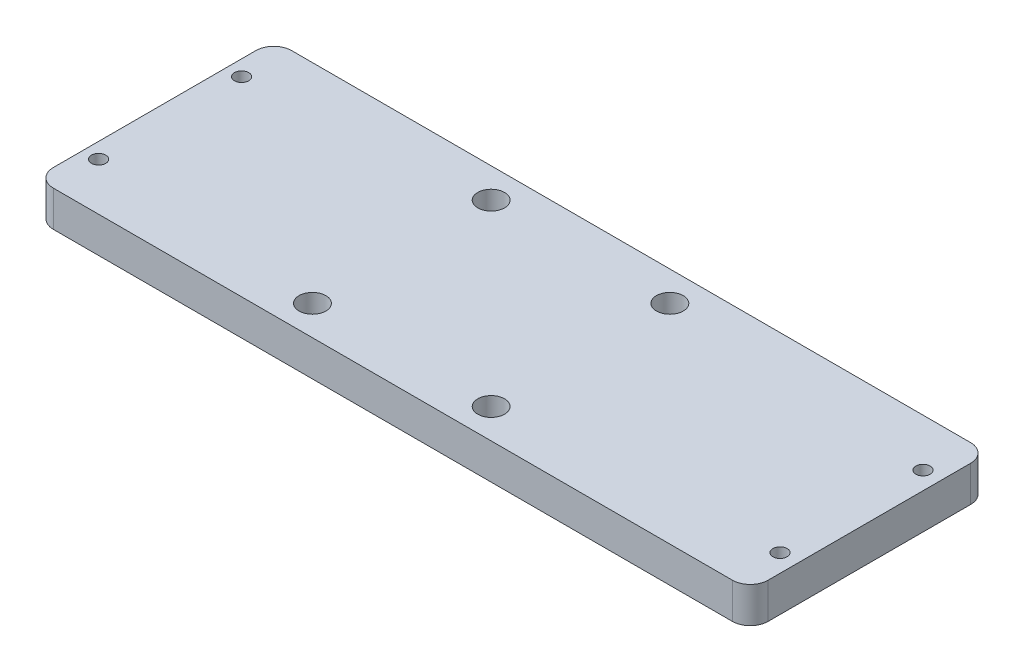
ISO-10303-21;
HEADER;
FILE_DESCRIPTION(('STEP AP214'),'2;1');
FILE_NAME('part.step','',(''),(''),'','','');
FILE_SCHEMA(('AUTOMOTIVE_DESIGN { 1 0 10303 214 1 1 1 1 }'));
ENDSEC;
DATA;
#1=APPLICATION_CONTEXT('core data for automotive mechanical design processes');
#2=APPLICATION_PROTOCOL_DEFINITION('international standard','automotive_design',2000,#1);
#3=PRODUCT_CONTEXT('',#1,'mechanical');
#4=PRODUCT('Part','Part','',(#3));
#5=PRODUCT_RELATED_PRODUCT_CATEGORY('part','',(#4));
#6=PRODUCT_DEFINITION_FORMATION('','',#4);
#7=PRODUCT_DEFINITION_CONTEXT('part definition',#1,'design');
#8=PRODUCT_DEFINITION('design','',#6,#7);
#9=PRODUCT_DEFINITION_SHAPE('','',#8);
#10=(LENGTH_UNIT() NAMED_UNIT(*) SI_UNIT(.MILLI.,.METRE.));
#11=(NAMED_UNIT(*) PLANE_ANGLE_UNIT() SI_UNIT($,.RADIAN.));
#12=(NAMED_UNIT(*) SI_UNIT($,.STERADIAN.) SOLID_ANGLE_UNIT());
#13=UNCERTAINTY_MEASURE_WITH_UNIT(LENGTH_MEASURE(1.E-05),#10,'distance_accuracy_value','');
#14=(GEOMETRIC_REPRESENTATION_CONTEXT(3) GLOBAL_UNCERTAINTY_ASSIGNED_CONTEXT((#13)) GLOBAL_UNIT_ASSIGNED_CONTEXT((#10,
#11,#12)) REPRESENTATION_CONTEXT('',''));
#15=CARTESIAN_POINT('',(0.,0.,0.));
#16=DIRECTION('',(0.,0.,1.));
#17=DIRECTION('',(1.,0.,0.));
#18=AXIS2_PLACEMENT_3D('',#15,#16,#17);
#19=CARTESIAN_POINT('',(0.,6.,0.));
#20=DIRECTION('',(0.,1.,0.));
#21=DIRECTION('',(0.,0.,1.));
#22=AXIS2_PLACEMENT_3D('',#19,#20,#21);
#23=PLANE('',#22);
#24=CARTESIAN_POINT('',(-15.,6.,15.));
#25=DIRECTION('',(0.,1.,0.));
#26=DIRECTION('',(0.,0.,-1.));
#27=AXIS2_PLACEMENT_3D('',#24,#25,#26);
#28=CIRCLE('',#27,2.25);
#29=CARTESIAN_POINT('',(-15.,6.,12.75));
#30=VERTEX_POINT('',#29);
#31=EDGE_CURVE('E149',#30,#30,#28,.T.);
#32=ORIENTED_EDGE('',*,*,#31,.F.);
#33=EDGE_LOOP('',(#32));
#34=FACE_BOUND('',#33,.T.);
#35=CARTESIAN_POINT('',(60.5,6.,12.));
#36=DIRECTION('',(0.,1.,0.));
#37=DIRECTION('',(0.,0.,-1.));
#38=AXIS2_PLACEMENT_3D('',#35,#36,#37);
#39=CIRCLE('',#38,1.2);
#40=CARTESIAN_POINT('',(60.5,6.,10.8));
#41=VERTEX_POINT('',#40);
#42=EDGE_CURVE('E165',#41,#41,#39,.T.);
#43=ORIENTED_EDGE('',*,*,#42,.F.);
#44=EDGE_LOOP('',(#43));
#45=FACE_BOUND('',#44,.T.);
#46=CARTESIAN_POINT('',(-15.,6.,-15.));
#47=DIRECTION('',(0.,1.,0.));
#48=DIRECTION('',(0.,0.,1.));
#49=AXIS2_PLACEMENT_3D('',#46,#47,#48);
#50=CIRCLE('',#49,2.25);
#51=CARTESIAN_POINT('',(-15.,6.,-12.75));
#52=VERTEX_POINT('',#51);
#53=EDGE_CURVE('E181',#52,#52,#50,.T.);
#54=ORIENTED_EDGE('',*,*,#53,.F.);
#55=EDGE_LOOP('',(#54));
#56=FACE_BOUND('',#55,.T.);
#57=CARTESIAN_POINT('',(60.5,6.,-12.));
#58=DIRECTION('',(0.,1.,0.));
#59=DIRECTION('',(0.,0.,1.));
#60=AXIS2_PLACEMENT_3D('',#57,#58,#59);
#61=CIRCLE('',#60,1.2);
#62=CARTESIAN_POINT('',(60.5,6.,-10.8));
#63=VERTEX_POINT('',#62);
#64=EDGE_CURVE('E197',#63,#63,#61,.T.);
#65=ORIENTED_EDGE('',*,*,#64,.F.);
#66=EDGE_LOOP('',(#65));
#67=FACE_BOUND('',#66,.T.);
#68=CARTESIAN_POINT('',(-53.9,6.,-12.));
#69=DIRECTION('',(0.,1.,0.));
#70=DIRECTION('',(0.,0.,1.));
#71=AXIS2_PLACEMENT_3D('',#68,#69,#70);
#72=CIRCLE('',#71,1.2);
#73=CARTESIAN_POINT('',(-53.9,6.,-10.8));
#74=VERTEX_POINT('',#73);
#75=EDGE_CURVE('E189',#74,#74,#72,.T.);
#76=ORIENTED_EDGE('',*,*,#75,.F.);
#77=EDGE_LOOP('',(#76));
#78=FACE_BOUND('',#77,.T.);
#79=CARTESIAN_POINT('',(15.,6.,-15.));
#80=DIRECTION('',(0.,1.,0.));
#81=DIRECTION('',(0.,0.,-1.));
#82=AXIS2_PLACEMENT_3D('',#79,#80,#81);
#83=CIRCLE('',#82,2.25);
#84=CARTESIAN_POINT('',(15.,6.,-17.25));
#85=VERTEX_POINT('',#84);
#86=EDGE_CURVE('E173',#85,#85,#83,.T.);
#87=ORIENTED_EDGE('',*,*,#86,.F.);
#88=EDGE_LOOP('',(#87));
#89=FACE_BOUND('',#88,.T.);
#90=CARTESIAN_POINT('',(15.,6.,15.));
#91=DIRECTION('',(0.,1.,0.));
#92=DIRECTION('',(0.,0.,1.));
#93=AXIS2_PLACEMENT_3D('',#90,#91,#92);
#94=CIRCLE('',#93,2.25);
#95=CARTESIAN_POINT('',(15.,6.,17.25));
#96=VERTEX_POINT('',#95);
#97=EDGE_CURVE('E157',#96,#96,#94,.T.);
#98=ORIENTED_EDGE('',*,*,#97,.F.);
#99=EDGE_LOOP('',(#98));
#100=FACE_BOUND('',#99,.T.);
#101=CARTESIAN_POINT('',(-53.9,6.,12.));
#102=DIRECTION('',(0.,1.,0.));
#103=DIRECTION('',(0.,0.,-1.));
#104=AXIS2_PLACEMENT_3D('',#101,#102,#103);
#105=CIRCLE('',#104,1.2);
#106=CARTESIAN_POINT('',(-53.9,6.,10.8));
#107=VERTEX_POINT('',#106);
#108=EDGE_CURVE('E141',#107,#107,#105,.T.);
#109=ORIENTED_EDGE('',*,*,#108,.F.);
#110=EDGE_LOOP('',(#109));
#111=FACE_BOUND('',#110,.T.);
#112=DIRECTION('',(-1.,0.,0.));
#113=VECTOR('',#112,1.);
#114=CARTESIAN_POINT('',(-63.5,6.,-20.));
#115=LINE('',#114,#113);
#116=CARTESIAN_POINT('',(60.5,6.,-20.));
#117=VERTEX_POINT('',#116);
#118=CARTESIAN_POINT('',(-53.5,6.,-20.));
#119=VERTEX_POINT('',#118);
#120=EDGE_CURVE('E208',#117,#119,#115,.T.);
#121=ORIENTED_EDGE('',*,*,#120,.T.);
#122=CARTESIAN_POINT('',(-53.5,6.,-17.));
#123=DIRECTION('',(0.,1.,0.));
#124=DIRECTION('',(0.,0.,1.));
#125=AXIS2_PLACEMENT_3D('',#122,#123,#124);
#126=CIRCLE('',#125,3.);
#127=CARTESIAN_POINT('',(-56.5,6.,-17.));
#128=VERTEX_POINT('',#127);
#129=EDGE_CURVE('E246',#119,#128,#126,.T.);
#130=ORIENTED_EDGE('',*,*,#129,.T.);
#131=DIRECTION('',(0.,0.,-1.));
#132=VECTOR('',#131,1.);
#133=CARTESIAN_POINT('',(-56.5,6.,20.));
#134=LINE('',#133,#132);
#135=CARTESIAN_POINT('',(-56.5,6.,17.));
#136=VERTEX_POINT('',#135);
#137=EDGE_CURVE('E127',#136,#128,#134,.T.);
#138=ORIENTED_EDGE('',*,*,#137,.F.);
#139=CARTESIAN_POINT('',(-53.5,6.,17.));
#140=DIRECTION('',(0.,1.,0.));
#141=DIRECTION('',(0.,0.,1.));
#142=AXIS2_PLACEMENT_3D('',#139,#140,#141);
#143=CIRCLE('',#142,3.);
#144=CARTESIAN_POINT('',(-53.5,6.,20.));
#145=VERTEX_POINT('',#144);
#146=EDGE_CURVE('E238',#136,#145,#143,.T.);
#147=ORIENTED_EDGE('',*,*,#146,.T.);
#148=DIRECTION('',(1.,0.,0.));
#149=VECTOR('',#148,1.);
#150=CARTESIAN_POINT('',(-63.5,6.,20.));
#151=LINE('',#150,#149);
#152=CARTESIAN_POINT('',(60.5,6.,20.));
#153=VERTEX_POINT('',#152);
#154=EDGE_CURVE('E213',#145,#153,#151,.T.);
#155=ORIENTED_EDGE('',*,*,#154,.T.);
#156=CARTESIAN_POINT('',(60.5,6.,17.));
#157=DIRECTION('',(0.,1.,0.));
#158=DIRECTION('',(0.,0.,1.));
#159=AXIS2_PLACEMENT_3D('',#156,#157,#158);
#160=CIRCLE('',#159,3.);
#161=CARTESIAN_POINT('',(63.5,6.,17.));
#162=VERTEX_POINT('',#161);
#163=EDGE_CURVE('E61',#153,#162,#160,.T.);
#164=ORIENTED_EDGE('',*,*,#163,.T.);
#165=DIRECTION('',(0.,0.,-1.));
#166=VECTOR('',#165,1.);
#167=CARTESIAN_POINT('',(63.5,6.,-20.));
#168=LINE('',#167,#166);
#169=CARTESIAN_POINT('',(63.5,6.,-17.));
#170=VERTEX_POINT('',#169);
#171=EDGE_CURVE('E205',#162,#170,#168,.T.);
#172=ORIENTED_EDGE('',*,*,#171,.T.);
#173=CARTESIAN_POINT('',(60.5,6.,-17.));
#174=DIRECTION('',(0.,1.,0.));
#175=DIRECTION('',(0.,0.,1.));
#176=AXIS2_PLACEMENT_3D('',#173,#174,#175);
#177=CIRCLE('',#176,3.);
#178=EDGE_CURVE('E243',#170,#117,#177,.T.);
#179=ORIENTED_EDGE('',*,*,#178,.T.);
#180=EDGE_LOOP('',(#121,#130,#138,#147,#155,#164,#172,#179));
#181=FACE_BOUND('',#180,.T.);
#182=ADVANCED_FACE('F38',(#34,#45,#56,#67,#78,#89,#100,#111,#181),#23,.T.);
#183=CARTESIAN_POINT('',(0.,0.,0.));
#184=DIRECTION('',(0.,1.,0.));
#185=DIRECTION('',(0.,0.,1.));
#186=AXIS2_PLACEMENT_3D('',#183,#184,#185);
#187=PLANE('',#186);
#188=CARTESIAN_POINT('',(-53.9,0.,12.));
#189=DIRECTION('',(0.,1.,0.));
#190=DIRECTION('',(0.,0.,-1.));
#191=AXIS2_PLACEMENT_3D('',#188,#189,#190);
#192=CIRCLE('',#191,1.2);
#193=CARTESIAN_POINT('',(-53.9,0.,10.8));
#194=VERTEX_POINT('',#193);
#195=EDGE_CURVE('E138',#194,#194,#192,.T.);
#196=ORIENTED_EDGE('',*,*,#195,.T.);
#197=EDGE_LOOP('',(#196));
#198=FACE_BOUND('',#197,.T.);
#199=CARTESIAN_POINT('',(-15.,0.,15.));
#200=DIRECTION('',(0.,1.,0.));
#201=DIRECTION('',(0.,0.,-1.));
#202=AXIS2_PLACEMENT_3D('',#199,#200,#201);
#203=CIRCLE('',#202,2.25);
#204=CARTESIAN_POINT('',(-15.,0.,12.75));
#205=VERTEX_POINT('',#204);
#206=EDGE_CURVE('E145',#205,#205,#203,.T.);
#207=ORIENTED_EDGE('',*,*,#206,.T.);
#208=EDGE_LOOP('',(#207));
#209=FACE_BOUND('',#208,.T.);
#210=CARTESIAN_POINT('',(15.,0.,15.));
#211=DIRECTION('',(0.,1.,0.));
#212=DIRECTION('',(0.,0.,1.));
#213=AXIS2_PLACEMENT_3D('',#210,#211,#212);
#214=CIRCLE('',#213,2.25);
#215=CARTESIAN_POINT('',(15.,0.,17.25));
#216=VERTEX_POINT('',#215);
#217=EDGE_CURVE('E153',#216,#216,#214,.T.);
#218=ORIENTED_EDGE('',*,*,#217,.T.);
#219=EDGE_LOOP('',(#218));
#220=FACE_BOUND('',#219,.T.);
#221=CARTESIAN_POINT('',(60.5,0.,12.));
#222=DIRECTION('',(0.,1.,0.));
#223=DIRECTION('',(0.,0.,-1.));
#224=AXIS2_PLACEMENT_3D('',#221,#222,#223);
#225=CIRCLE('',#224,1.2);
#226=CARTESIAN_POINT('',(60.5,0.,10.8));
#227=VERTEX_POINT('',#226);
#228=EDGE_CURVE('E161',#227,#227,#225,.T.);
#229=ORIENTED_EDGE('',*,*,#228,.T.);
#230=EDGE_LOOP('',(#229));
#231=FACE_BOUND('',#230,.T.);
#232=CARTESIAN_POINT('',(15.,0.,-15.));
#233=DIRECTION('',(0.,1.,0.));
#234=DIRECTION('',(0.,0.,-1.));
#235=AXIS2_PLACEMENT_3D('',#232,#233,#234);
#236=CIRCLE('',#235,2.25);
#237=CARTESIAN_POINT('',(15.,0.,-17.25));
#238=VERTEX_POINT('',#237);
#239=EDGE_CURVE('E169',#238,#238,#236,.T.);
#240=ORIENTED_EDGE('',*,*,#239,.T.);
#241=EDGE_LOOP('',(#240));
#242=FACE_BOUND('',#241,.T.);
#243=CARTESIAN_POINT('',(-15.,0.,-15.));
#244=DIRECTION('',(0.,1.,0.));
#245=DIRECTION('',(0.,0.,1.));
#246=AXIS2_PLACEMENT_3D('',#243,#244,#245);
#247=CIRCLE('',#246,2.25);
#248=CARTESIAN_POINT('',(-15.,0.,-12.75));
#249=VERTEX_POINT('',#248);
#250=EDGE_CURVE('E177',#249,#249,#247,.T.);
#251=ORIENTED_EDGE('',*,*,#250,.T.);
#252=EDGE_LOOP('',(#251));
#253=FACE_BOUND('',#252,.T.);
#254=CARTESIAN_POINT('',(-53.9,0.,-12.));
#255=DIRECTION('',(0.,1.,0.));
#256=DIRECTION('',(0.,0.,1.));
#257=AXIS2_PLACEMENT_3D('',#254,#255,#256);
#258=CIRCLE('',#257,1.2);
#259=CARTESIAN_POINT('',(-53.9,0.,-10.8));
#260=VERTEX_POINT('',#259);
#261=EDGE_CURVE('E185',#260,#260,#258,.T.);
#262=ORIENTED_EDGE('',*,*,#261,.T.);
#263=EDGE_LOOP('',(#262));
#264=FACE_BOUND('',#263,.T.);
#265=CARTESIAN_POINT('',(60.5,0.,-12.));
#266=DIRECTION('',(0.,1.,0.));
#267=DIRECTION('',(0.,0.,1.));
#268=AXIS2_PLACEMENT_3D('',#265,#266,#267);
#269=CIRCLE('',#268,1.2);
#270=CARTESIAN_POINT('',(60.5,0.,-10.8));
#271=VERTEX_POINT('',#270);
#272=EDGE_CURVE('E193',#271,#271,#269,.T.);
#273=ORIENTED_EDGE('',*,*,#272,.T.);
#274=EDGE_LOOP('',(#273));
#275=FACE_BOUND('',#274,.T.);
#276=DIRECTION('',(0.,0.,1.));
#277=VECTOR('',#276,1.);
#278=CARTESIAN_POINT('',(-56.5,0.,-20.));
#279=LINE('',#278,#277);
#280=CARTESIAN_POINT('',(-56.5,0.,-17.));
#281=VERTEX_POINT('',#280);
#282=CARTESIAN_POINT('',(-56.5,0.,17.));
#283=VERTEX_POINT('',#282);
#284=EDGE_CURVE('E124',#281,#283,#279,.T.);
#285=ORIENTED_EDGE('',*,*,#284,.F.);
#286=CARTESIAN_POINT('',(-53.5,0.,-17.));
#287=DIRECTION('',(0.,1.,0.));
#288=DIRECTION('',(0.,0.,1.));
#289=AXIS2_PLACEMENT_3D('',#286,#287,#288);
#290=CIRCLE('',#289,3.);
#291=CARTESIAN_POINT('',(-53.5,0.,-20.));
#292=VERTEX_POINT('',#291);
#293=EDGE_CURVE('E105',#281,#292,#290,.F.);
#294=ORIENTED_EDGE('',*,*,#293,.T.);
#295=DIRECTION('',(-1.,0.,0.));
#296=VECTOR('',#295,1.);
#297=CARTESIAN_POINT('',(-63.5,0.,-20.));
#298=LINE('',#297,#296);
#299=CARTESIAN_POINT('',(60.5,0.,-20.));
#300=VERTEX_POINT('',#299);
#301=EDGE_CURVE('E218',#300,#292,#298,.T.);
#302=ORIENTED_EDGE('',*,*,#301,.F.);
#303=CARTESIAN_POINT('',(60.5,0.,-17.));
#304=DIRECTION('',(0.,1.,0.));
#305=DIRECTION('',(0.,0.,1.));
#306=AXIS2_PLACEMENT_3D('',#303,#304,#305);
#307=CIRCLE('',#306,3.);
#308=CARTESIAN_POINT('',(63.5,0.,-17.));
#309=VERTEX_POINT('',#308);
#310=EDGE_CURVE('E117',#300,#309,#307,.F.);
#311=ORIENTED_EDGE('',*,*,#310,.T.);
#312=DIRECTION('',(0.,0.,-1.));
#313=VECTOR('',#312,1.);
#314=CARTESIAN_POINT('',(63.5,0.,-20.));
#315=LINE('',#314,#313);
#316=CARTESIAN_POINT('',(63.5,0.,17.));
#317=VERTEX_POINT('',#316);
#318=EDGE_CURVE('E201',#317,#309,#315,.T.);
#319=ORIENTED_EDGE('',*,*,#318,.F.);
#320=CARTESIAN_POINT('',(60.5,0.,17.));
#321=DIRECTION('',(0.,1.,0.));
#322=DIRECTION('',(0.,0.,1.));
#323=AXIS2_PLACEMENT_3D('',#320,#321,#322);
#324=CIRCLE('',#323,3.);
#325=CARTESIAN_POINT('',(60.5,0.,20.));
#326=VERTEX_POINT('',#325);
#327=EDGE_CURVE('E228',#317,#326,#324,.F.);
#328=ORIENTED_EDGE('',*,*,#327,.T.);
#329=DIRECTION('',(1.,0.,0.));
#330=VECTOR('',#329,1.);
#331=CARTESIAN_POINT('',(-63.5,0.,20.));
#332=LINE('',#331,#330);
#333=CARTESIAN_POINT('',(-53.5,0.,20.));
#334=VERTEX_POINT('',#333);
#335=EDGE_CURVE('E209',#334,#326,#332,.T.);
#336=ORIENTED_EDGE('',*,*,#335,.F.);
#337=CARTESIAN_POINT('',(-53.5,0.,17.));
#338=DIRECTION('',(0.,1.,0.));
#339=DIRECTION('',(0.,0.,1.));
#340=AXIS2_PLACEMENT_3D('',#337,#338,#339);
#341=CIRCLE('',#340,3.);
#342=EDGE_CURVE('E129',#334,#283,#341,.F.);
#343=ORIENTED_EDGE('',*,*,#342,.T.);
#344=EDGE_LOOP('',(#285,#294,#302,#311,#319,#328,#336,#343));
#345=FACE_BOUND('',#344,.T.);
#346=ADVANCED_FACE('F132',(#198,#209,#220,#231,#242,#253,#264,#275,#345),#187,.F.);
#347=CARTESIAN_POINT('',(-63.5,6.,-20.));
#348=DIRECTION('',(0.,0.,1.));
#349=DIRECTION('',(1.,0.,0.));
#350=AXIS2_PLACEMENT_3D('',#347,#348,#349);
#351=PLANE('',#350);
#352=ORIENTED_EDGE('',*,*,#301,.T.);
#353=DIRECTION('',(0.,-1.,0.));
#354=VECTOR('',#353,1.);
#355=CARTESIAN_POINT('',(-53.5,6.,-20.));
#356=LINE('',#355,#354);
#357=EDGE_CURVE('E110',#292,#119,#356,.F.);
#358=ORIENTED_EDGE('',*,*,#357,.T.);
#359=ORIENTED_EDGE('',*,*,#120,.F.);
#360=DIRECTION('',(0.,-1.,0.));
#361=VECTOR('',#360,1.);
#362=CARTESIAN_POINT('',(60.5,6.,-20.));
#363=LINE('',#362,#361);
#364=EDGE_CURVE('E116',#117,#300,#363,.T.);
#365=ORIENTED_EDGE('',*,*,#364,.T.);
#366=EDGE_LOOP('',(#352,#358,#359,#365));
#367=FACE_BOUND('',#366,.T.);
#368=ADVANCED_FACE('F266',(#367),#351,.F.);
#369=CARTESIAN_POINT('',(-63.5,6.,20.));
#370=DIRECTION('',(0.,0.,-1.));
#371=DIRECTION('',(-1.,0.,0.));
#372=AXIS2_PLACEMENT_3D('',#369,#370,#371);
#373=PLANE('',#372);
#374=ORIENTED_EDGE('',*,*,#335,.T.);
#375=DIRECTION('',(0.,-1.,0.));
#376=VECTOR('',#375,1.);
#377=CARTESIAN_POINT('',(60.5,6.,20.));
#378=LINE('',#377,#376);
#379=EDGE_CURVE('E11',#326,#153,#378,.F.);
#380=ORIENTED_EDGE('',*,*,#379,.T.);
#381=ORIENTED_EDGE('',*,*,#154,.F.);
#382=DIRECTION('',(0.,1.,0.));
#383=VECTOR('',#382,1.);
#384=CARTESIAN_POINT('',(-53.5,0.,20.));
#385=LINE('',#384,#383);
#386=EDGE_CURVE('E47',#145,#334,#385,.F.);
#387=ORIENTED_EDGE('',*,*,#386,.T.);
#388=EDGE_LOOP('',(#374,#380,#381,#387));
#389=FACE_BOUND('',#388,.T.);
#390=ADVANCED_FACE('F258',(#389),#373,.F.);
#391=CARTESIAN_POINT('',(63.5,6.,-20.));
#392=DIRECTION('',(-1.,0.,0.));
#393=DIRECTION('',(0.,0.,1.));
#394=AXIS2_PLACEMENT_3D('',#391,#392,#393);
#395=PLANE('',#394);
#396=ORIENTED_EDGE('',*,*,#318,.T.);
#397=DIRECTION('',(0.,-1.,0.));
#398=VECTOR('',#397,1.);
#399=CARTESIAN_POINT('',(63.5,6.,-17.));
#400=LINE('',#399,#398);
#401=EDGE_CURVE('E54',#309,#170,#400,.F.);
#402=ORIENTED_EDGE('',*,*,#401,.T.);
#403=ORIENTED_EDGE('',*,*,#171,.F.);
#404=DIRECTION('',(0.,-1.,0.));
#405=VECTOR('',#404,1.);
#406=CARTESIAN_POINT('',(63.5,6.,17.));
#407=LINE('',#406,#405);
#408=EDGE_CURVE('E249',#162,#317,#407,.T.);
#409=ORIENTED_EDGE('',*,*,#408,.T.);
#410=EDGE_LOOP('',(#396,#402,#403,#409));
#411=FACE_BOUND('',#410,.T.);
#412=ADVANCED_FACE('F269',(#411),#395,.F.);
#413=CARTESIAN_POINT('',(60.5,6.,-12.));
#414=DIRECTION('',(0.,-1.,0.));
#415=DIRECTION('',(0.,0.,-1.));
#416=AXIS2_PLACEMENT_3D('',#413,#414,#415);
#417=CYLINDRICAL_SURFACE('',#416,1.2);
#418=ORIENTED_EDGE('',*,*,#64,.T.);
#419=EDGE_LOOP('',(#418));
#420=FACE_BOUND('',#419,.T.);
#421=ORIENTED_EDGE('',*,*,#272,.F.);
#422=EDGE_LOOP('',(#421));
#423=FACE_BOUND('',#422,.T.);
#424=ADVANCED_FACE('F291',(#420,#423),#417,.F.);
#425=CARTESIAN_POINT('',(-53.9,6.,-12.));
#426=DIRECTION('',(0.,-1.,0.));
#427=DIRECTION('',(0.,0.,-1.));
#428=AXIS2_PLACEMENT_3D('',#425,#426,#427);
#429=CYLINDRICAL_SURFACE('',#428,1.2);
#430=ORIENTED_EDGE('',*,*,#75,.T.);
#431=EDGE_LOOP('',(#430));
#432=FACE_BOUND('',#431,.T.);
#433=ORIENTED_EDGE('',*,*,#261,.F.);
#434=EDGE_LOOP('',(#433));
#435=FACE_BOUND('',#434,.T.);
#436=ADVANCED_FACE('F331',(#432,#435),#429,.F.);
#437=CARTESIAN_POINT('',(-15.,6.,-15.));
#438=DIRECTION('',(0.,-1.,0.));
#439=DIRECTION('',(0.,0.,-1.));
#440=AXIS2_PLACEMENT_3D('',#437,#438,#439);
#441=CYLINDRICAL_SURFACE('',#440,2.25);
#442=ORIENTED_EDGE('',*,*,#53,.T.);
#443=EDGE_LOOP('',(#442));
#444=FACE_BOUND('',#443,.T.);
#445=ORIENTED_EDGE('',*,*,#250,.F.);
#446=EDGE_LOOP('',(#445));
#447=FACE_BOUND('',#446,.T.);
#448=ADVANCED_FACE('F328',(#444,#447),#441,.F.);
#449=CARTESIAN_POINT('',(15.,6.,-15.));
#450=DIRECTION('',(0.,-1.,0.));
#451=DIRECTION('',(0.,0.,-1.));
#452=AXIS2_PLACEMENT_3D('',#449,#450,#451);
#453=CYLINDRICAL_SURFACE('',#452,2.25);
#454=ORIENTED_EDGE('',*,*,#86,.T.);
#455=EDGE_LOOP('',(#454));
#456=FACE_BOUND('',#455,.T.);
#457=ORIENTED_EDGE('',*,*,#239,.F.);
#458=EDGE_LOOP('',(#457));
#459=FACE_BOUND('',#458,.T.);
#460=ADVANCED_FACE('F324',(#456,#459),#453,.F.);
#461=CARTESIAN_POINT('',(60.5,6.,12.));
#462=DIRECTION('',(0.,-1.,0.));
#463=DIRECTION('',(0.,0.,-1.));
#464=AXIS2_PLACEMENT_3D('',#461,#462,#463);
#465=CYLINDRICAL_SURFACE('',#464,1.2);
#466=ORIENTED_EDGE('',*,*,#42,.T.);
#467=EDGE_LOOP('',(#466));
#468=FACE_BOUND('',#467,.T.);
#469=ORIENTED_EDGE('',*,*,#228,.F.);
#470=EDGE_LOOP('',(#469));
#471=FACE_BOUND('',#470,.T.);
#472=ADVANCED_FACE('F320',(#468,#471),#465,.F.);
#473=CARTESIAN_POINT('',(15.,6.,15.));
#474=DIRECTION('',(0.,-1.,0.));
#475=DIRECTION('',(0.,0.,-1.));
#476=AXIS2_PLACEMENT_3D('',#473,#474,#475);
#477=CYLINDRICAL_SURFACE('',#476,2.25);
#478=ORIENTED_EDGE('',*,*,#97,.T.);
#479=EDGE_LOOP('',(#478));
#480=FACE_BOUND('',#479,.T.);
#481=ORIENTED_EDGE('',*,*,#217,.F.);
#482=EDGE_LOOP('',(#481));
#483=FACE_BOUND('',#482,.T.);
#484=ADVANCED_FACE('F316',(#480,#483),#477,.F.);
#485=CARTESIAN_POINT('',(-15.,6.,15.));
#486=DIRECTION('',(0.,-1.,0.));
#487=DIRECTION('',(0.,0.,-1.));
#488=AXIS2_PLACEMENT_3D('',#485,#486,#487);
#489=CYLINDRICAL_SURFACE('',#488,2.25);
#490=ORIENTED_EDGE('',*,*,#31,.T.);
#491=EDGE_LOOP('',(#490));
#492=FACE_BOUND('',#491,.T.);
#493=ORIENTED_EDGE('',*,*,#206,.F.);
#494=EDGE_LOOP('',(#493));
#495=FACE_BOUND('',#494,.T.);
#496=ADVANCED_FACE('F310',(#492,#495),#489,.F.);
#497=CARTESIAN_POINT('',(-53.9,6.,12.));
#498=DIRECTION('',(0.,-1.,0.));
#499=DIRECTION('',(0.,0.,-1.));
#500=AXIS2_PLACEMENT_3D('',#497,#498,#499);
#501=CYLINDRICAL_SURFACE('',#500,1.2);
#502=ORIENTED_EDGE('',*,*,#108,.T.);
#503=EDGE_LOOP('',(#502));
#504=FACE_BOUND('',#503,.T.);
#505=ORIENTED_EDGE('',*,*,#195,.F.);
#506=EDGE_LOOP('',(#505));
#507=FACE_BOUND('',#506,.T.);
#508=ADVANCED_FACE('F304',(#504,#507),#501,.F.);
#509=CARTESIAN_POINT('',(-56.5,0.,0.));
#510=DIRECTION('',(-1.,0.,0.));
#511=DIRECTION('',(0.,0.,1.));
#512=AXIS2_PLACEMENT_3D('',#509,#510,#511);
#513=PLANE('',#512);
#514=ORIENTED_EDGE('',*,*,#137,.T.);
#515=DIRECTION('',(0.,-1.,0.));
#516=VECTOR('',#515,1.);
#517=CARTESIAN_POINT('',(-56.5,0.,-17.));
#518=LINE('',#517,#516);
#519=EDGE_CURVE('E109',#128,#281,#518,.T.);
#520=ORIENTED_EDGE('',*,*,#519,.T.);
#521=ORIENTED_EDGE('',*,*,#284,.T.);
#522=DIRECTION('',(0.,1.,0.));
#523=VECTOR('',#522,1.);
#524=CARTESIAN_POINT('',(-56.5,6.,17.));
#525=LINE('',#524,#523);
#526=EDGE_CURVE('E130',#283,#136,#525,.T.);
#527=ORIENTED_EDGE('',*,*,#526,.T.);
#528=EDGE_LOOP('',(#514,#520,#521,#527));
#529=FACE_BOUND('',#528,.T.);
#530=ADVANCED_FACE('F122',(#529),#513,.T.);
#531=CARTESIAN_POINT('',(-53.5,0.,-17.));
#532=DIRECTION('',(0.,1.,0.));
#533=DIRECTION('',(0.,0.,1.));
#534=AXIS2_PLACEMENT_3D('',#531,#532,#533);
#535=CYLINDRICAL_SURFACE('',#534,3.);
#536=ORIENTED_EDGE('',*,*,#129,.F.);
#537=ORIENTED_EDGE('',*,*,#357,.F.);
#538=ORIENTED_EDGE('',*,*,#293,.F.);
#539=ORIENTED_EDGE('',*,*,#519,.F.);
#540=EDGE_LOOP('',(#536,#537,#538,#539));
#541=FACE_BOUND('',#540,.T.);
#542=ADVANCED_FACE('F108',(#541),#535,.T.);
#543=CARTESIAN_POINT('',(60.5,6.,-17.));
#544=DIRECTION('',(0.,-1.,0.));
#545=DIRECTION('',(0.,0.,-1.));
#546=AXIS2_PLACEMENT_3D('',#543,#544,#545);
#547=CYLINDRICAL_SURFACE('',#546,3.);
#548=ORIENTED_EDGE('',*,*,#178,.F.);
#549=ORIENTED_EDGE('',*,*,#401,.F.);
#550=ORIENTED_EDGE('',*,*,#310,.F.);
#551=ORIENTED_EDGE('',*,*,#364,.F.);
#552=EDGE_LOOP('',(#548,#549,#550,#551));
#553=FACE_BOUND('',#552,.T.);
#554=ADVANCED_FACE('F268',(#553),#547,.T.);
#555=CARTESIAN_POINT('',(60.5,6.,17.));
#556=DIRECTION('',(0.,-1.,0.));
#557=DIRECTION('',(0.,0.,-1.));
#558=AXIS2_PLACEMENT_3D('',#555,#556,#557);
#559=CYLINDRICAL_SURFACE('',#558,3.);
#560=ORIENTED_EDGE('',*,*,#163,.F.);
#561=ORIENTED_EDGE('',*,*,#379,.F.);
#562=ORIENTED_EDGE('',*,*,#327,.F.);
#563=ORIENTED_EDGE('',*,*,#408,.F.);
#564=EDGE_LOOP('',(#560,#561,#562,#563));
#565=FACE_BOUND('',#564,.T.);
#566=ADVANCED_FACE('F272',(#565),#559,.T.);
#567=CARTESIAN_POINT('',(-53.5,0.,17.));
#568=DIRECTION('',(0.,-1.,0.));
#569=DIRECTION('',(0.,0.,-1.));
#570=AXIS2_PLACEMENT_3D('',#567,#568,#569);
#571=CYLINDRICAL_SURFACE('',#570,3.);
#572=ORIENTED_EDGE('',*,*,#342,.F.);
#573=ORIENTED_EDGE('',*,*,#386,.F.);
#574=ORIENTED_EDGE('',*,*,#146,.F.);
#575=ORIENTED_EDGE('',*,*,#526,.F.);
#576=EDGE_LOOP('',(#572,#573,#574,#575));
#577=FACE_BOUND('',#576,.T.);
#578=ADVANCED_FACE('F40',(#577),#571,.T.);
#579=CLOSED_SHELL('',(#182,#346,#368,#390,#412,#424,#436,#448,#460,#472,#484,#496,#508,#530,
#542,#554,#566,#578));
#580=MANIFOLD_SOLID_BREP('B2',#579);
#581=ADVANCED_BREP_SHAPE_REPRESENTATION('',(#18,#580),#14);
#582=SHAPE_DEFINITION_REPRESENTATION(#9,#581);
ENDSEC;
END-ISO-10303-21;
